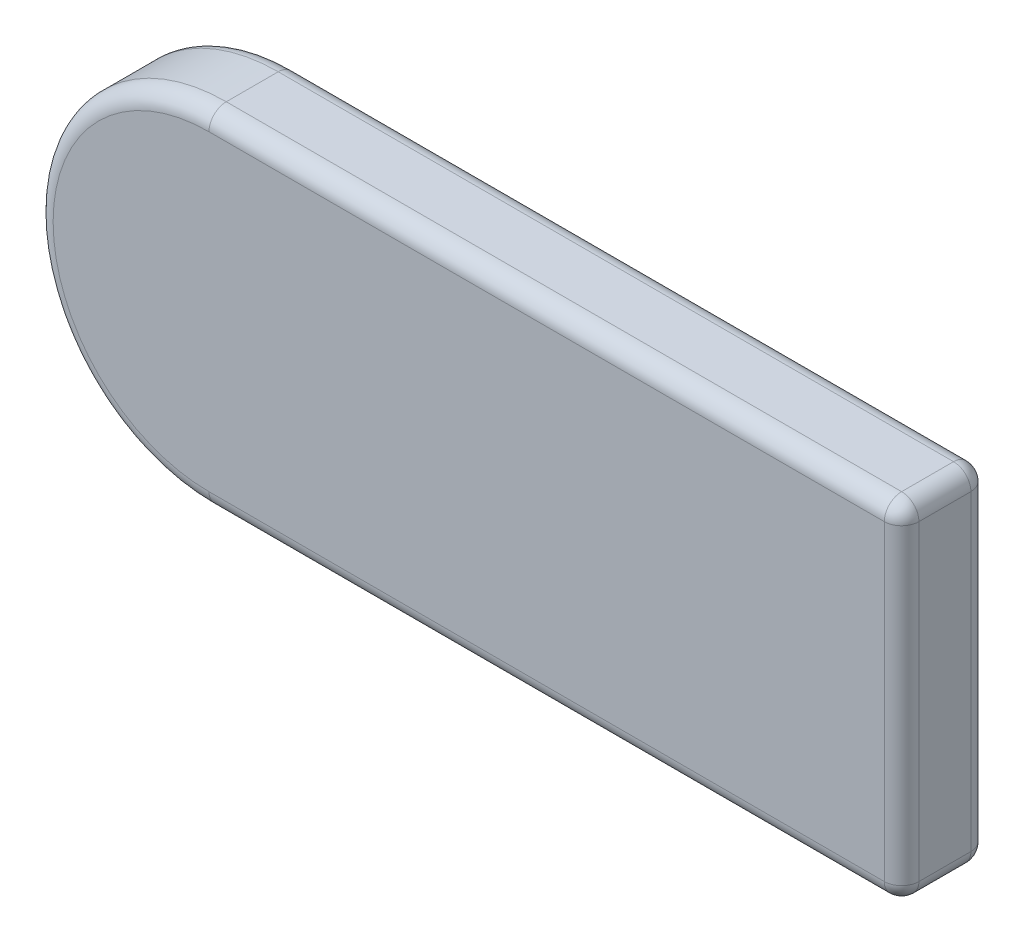
ISO-10303-21;
HEADER;
FILE_DESCRIPTION(('STEP AP214'),'2;1');
FILE_NAME('part.step','',(''),(''),'','','');
FILE_SCHEMA(('AUTOMOTIVE_DESIGN { 1 0 10303 214 1 1 1 1 }'));
ENDSEC;
DATA;
#1=APPLICATION_CONTEXT('core data for automotive mechanical design processes');
#2=APPLICATION_PROTOCOL_DEFINITION('international standard','automotive_design',2000,#1);
#3=PRODUCT_CONTEXT('',#1,'mechanical');
#4=PRODUCT('Part','Part','',(#3));
#5=PRODUCT_RELATED_PRODUCT_CATEGORY('part','',(#4));
#6=PRODUCT_DEFINITION_FORMATION('','',#4);
#7=PRODUCT_DEFINITION_CONTEXT('part definition',#1,'design');
#8=PRODUCT_DEFINITION('design','',#6,#7);
#9=PRODUCT_DEFINITION_SHAPE('','',#8);
#10=(LENGTH_UNIT() NAMED_UNIT(*) SI_UNIT(.MILLI.,.METRE.));
#11=(NAMED_UNIT(*) PLANE_ANGLE_UNIT() SI_UNIT($,.RADIAN.));
#12=(NAMED_UNIT(*) SI_UNIT($,.STERADIAN.) SOLID_ANGLE_UNIT());
#13=UNCERTAINTY_MEASURE_WITH_UNIT(LENGTH_MEASURE(1.E-05),#10,'distance_accuracy_value','');
#14=(GEOMETRIC_REPRESENTATION_CONTEXT(3) GLOBAL_UNCERTAINTY_ASSIGNED_CONTEXT((#13)) GLOBAL_UNIT_ASSIGNED_CONTEXT((#10,
#11,#12)) REPRESENTATION_CONTEXT('',''));
#15=CARTESIAN_POINT('',(0.,0.,0.));
#16=DIRECTION('',(0.,0.,1.));
#17=DIRECTION('',(1.,0.,0.));
#18=AXIS2_PLACEMENT_3D('',#15,#16,#17);
#19=CARTESIAN_POINT('',(2.,-1.,0.5));
#20=DIRECTION('',(-1.,0.,0.));
#21=DIRECTION('',(0.,0.,1.));
#22=AXIS2_PLACEMENT_3D('',#19,#20,#21);
#23=PLANE('',#22);
#24=DIRECTION('',(0.,0.,-1.));
#25=VECTOR('',#24,1.);
#26=CARTESIAN_POINT('',(2.,-0.9,0.));
#27=LINE('',#26,#25);
#28=CARTESIAN_POINT('',(2.,-0.9,0.4));
#29=VERTEX_POINT('',#28);
#30=CARTESIAN_POINT('',(2.,-0.9,0.1));
#31=VERTEX_POINT('',#30);
#32=EDGE_CURVE('E119',#29,#31,#27,.T.);
#33=ORIENTED_EDGE('',*,*,#32,.T.);
#34=DIRECTION('',(0.,1.,0.));
#35=VECTOR('',#34,1.);
#36=CARTESIAN_POINT('',(2.,-1.,0.1));
#37=LINE('',#36,#35);
#38=CARTESIAN_POINT('',(2.,0.9,0.1));
#39=VERTEX_POINT('',#38);
#40=EDGE_CURVE('E114',#31,#39,#37,.T.);
#41=ORIENTED_EDGE('',*,*,#40,.T.);
#42=DIRECTION('',(0.,0.,-1.));
#43=VECTOR('',#42,1.);
#44=CARTESIAN_POINT('',(2.,0.9,0.5));
#45=LINE('',#44,#43);
#46=CARTESIAN_POINT('',(2.,0.9,0.4));
#47=VERTEX_POINT('',#46);
#48=EDGE_CURVE('E116',#39,#47,#45,.F.);
#49=ORIENTED_EDGE('',*,*,#48,.T.);
#50=DIRECTION('',(0.,1.,0.));
#51=VECTOR('',#50,1.);
#52=CARTESIAN_POINT('',(2.,-0.9,0.4));
#53=LINE('',#52,#51);
#54=EDGE_CURVE('E125',#47,#29,#53,.F.);
#55=ORIENTED_EDGE('',*,*,#54,.T.);
#56=EDGE_LOOP('',(#33,#41,#49,#55));
#57=FACE_BOUND('',#56,.T.);
#58=ADVANCED_FACE('F36',(#57),#23,.F.);
#59=CARTESIAN_POINT('',(2.,1.,0.5));
#60=DIRECTION('',(0.,-1.,0.));
#61=DIRECTION('',(1.,0.,0.));
#62=AXIS2_PLACEMENT_3D('',#59,#60,#61);
#63=PLANE('',#62);
#64=DIRECTION('',(0.,0.,-1.));
#65=VECTOR('',#64,1.);
#66=CARTESIAN_POINT('',(1.9,1.,0.5));
#67=LINE('',#66,#65);
#68=CARTESIAN_POINT('',(1.9,1.,0.4));
#69=VERTEX_POINT('',#68);
#70=CARTESIAN_POINT('',(1.9,1.,0.1));
#71=VERTEX_POINT('',#70);
#72=EDGE_CURVE('E235',#69,#71,#67,.T.);
#73=ORIENTED_EDGE('',*,*,#72,.T.);
#74=DIRECTION('',(-1.,0.,0.));
#75=VECTOR('',#74,1.);
#76=CARTESIAN_POINT('',(2.,1.,0.1));
#77=LINE('',#76,#75);
#78=CARTESIAN_POINT('',(-2.,1.,0.1));
#79=VERTEX_POINT('',#78);
#80=EDGE_CURVE('E231',#71,#79,#77,.T.);
#81=ORIENTED_EDGE('',*,*,#80,.T.);
#82=DIRECTION('',(0.,0.,-1.));
#83=VECTOR('',#82,1.);
#84=CARTESIAN_POINT('',(-2.,1.,0.5));
#85=LINE('',#84,#83);
#86=CARTESIAN_POINT('',(-2.,1.,0.4));
#87=VERTEX_POINT('',#86);
#88=EDGE_CURVE('E136',#87,#79,#85,.T.);
#89=ORIENTED_EDGE('',*,*,#88,.F.);
#90=DIRECTION('',(-1.,0.,0.));
#91=VECTOR('',#90,1.);
#92=CARTESIAN_POINT('',(1.9,1.,0.4));
#93=LINE('',#92,#91);
#94=EDGE_CURVE('E144',#87,#69,#93,.F.);
#95=ORIENTED_EDGE('',*,*,#94,.T.);
#96=EDGE_LOOP('',(#73,#81,#89,#95));
#97=FACE_BOUND('',#96,.T.);
#98=ADVANCED_FACE('F272',(#97),#63,.F.);
#99=CARTESIAN_POINT('',(-2.,0.,0.5));
#100=DIRECTION('',(0.,0.,-1.));
#101=DIRECTION('',(-1.,0.,0.));
#102=AXIS2_PLACEMENT_3D('',#99,#100,#101);
#103=CYLINDRICAL_SURFACE('',#102,1.);
#104=ORIENTED_EDGE('',*,*,#88,.T.);
#105=CARTESIAN_POINT('',(-2.,0.,0.1));
#106=DIRECTION('',(0.,0.,1.));
#107=DIRECTION('',(1.,0.,0.));
#108=AXIS2_PLACEMENT_3D('',#105,#106,#107);
#109=CIRCLE('',#108,1.);
#110=CARTESIAN_POINT('',(-2.,-1.,0.1));
#111=VERTEX_POINT('',#110);
#112=EDGE_CURVE('E196',#79,#111,#109,.T.);
#113=ORIENTED_EDGE('',*,*,#112,.T.);
#114=DIRECTION('',(0.,0.,-1.));
#115=VECTOR('',#114,1.);
#116=CARTESIAN_POINT('',(-2.,-1.,0.5));
#117=LINE('',#116,#115);
#118=CARTESIAN_POINT('',(-2.,-1.,0.4));
#119=VERTEX_POINT('',#118);
#120=EDGE_CURVE('E167',#119,#111,#117,.T.);
#121=ORIENTED_EDGE('',*,*,#120,.F.);
#122=CARTESIAN_POINT('',(-2.,0.,0.4));
#123=DIRECTION('',(0.,0.,1.));
#124=DIRECTION('',(1.,0.,0.));
#125=AXIS2_PLACEMENT_3D('',#122,#123,#124);
#126=CIRCLE('',#125,1.);
#127=EDGE_CURVE('E199',#119,#87,#126,.F.);
#128=ORIENTED_EDGE('',*,*,#127,.T.);
#129=EDGE_LOOP('',(#104,#113,#121,#128));
#130=FACE_BOUND('',#129,.T.);
#131=ADVANCED_FACE('F276',(#130),#103,.T.);
#132=CARTESIAN_POINT('',(2.,-1.,0.5));
#133=DIRECTION('',(0.,-1.,0.));
#134=DIRECTION('',(1.,0.,0.));
#135=AXIS2_PLACEMENT_3D('',#132,#133,#134);
#136=PLANE('',#135);
#137=ORIENTED_EDGE('',*,*,#120,.T.);
#138=DIRECTION('',(-1.,0.,0.));
#139=VECTOR('',#138,1.);
#140=CARTESIAN_POINT('',(1.9,-1.,0.1));
#141=LINE('',#140,#139);
#142=CARTESIAN_POINT('',(1.9,-1.,0.1));
#143=VERTEX_POINT('',#142);
#144=EDGE_CURVE('E195',#111,#143,#141,.F.);
#145=ORIENTED_EDGE('',*,*,#144,.T.);
#146=DIRECTION('',(0.,0.,-1.));
#147=VECTOR('',#146,1.);
#148=CARTESIAN_POINT('',(1.9,-1.,0.5));
#149=LINE('',#148,#147);
#150=CARTESIAN_POINT('',(1.9,-1.,0.4));
#151=VERTEX_POINT('',#150);
#152=EDGE_CURVE('E237',#143,#151,#149,.F.);
#153=ORIENTED_EDGE('',*,*,#152,.T.);
#154=DIRECTION('',(-1.,0.,0.));
#155=VECTOR('',#154,1.);
#156=CARTESIAN_POINT('',(2.,-1.,0.4));
#157=LINE('',#156,#155);
#158=EDGE_CURVE('E190',#151,#119,#157,.T.);
#159=ORIENTED_EDGE('',*,*,#158,.T.);
#160=EDGE_LOOP('',(#137,#145,#153,#159));
#161=FACE_BOUND('',#160,.T.);
#162=ADVANCED_FACE('F242',(#161),#136,.T.);
#163=CARTESIAN_POINT('',(-2.,0.,0.5));
#164=DIRECTION('',(0.,0.,1.));
#165=DIRECTION('',(1.,0.,0.));
#166=AXIS2_PLACEMENT_3D('',#163,#164,#165);
#167=PLANE('',#166);
#168=DIRECTION('',(-1.,0.,0.));
#169=VECTOR('',#168,1.);
#170=CARTESIAN_POINT('',(-2.,0.9,0.5));
#171=LINE('',#170,#169);
#172=CARTESIAN_POINT('',(1.9,0.9,0.5));
#173=VERTEX_POINT('',#172);
#174=CARTESIAN_POINT('',(-2.,0.9,0.5));
#175=VERTEX_POINT('',#174);
#176=EDGE_CURVE('E45',#173,#175,#171,.T.);
#177=ORIENTED_EDGE('',*,*,#176,.T.);
#178=CARTESIAN_POINT('',(-2.,0.,0.5));
#179=DIRECTION('',(0.,0.,1.));
#180=DIRECTION('',(1.,0.,0.));
#181=AXIS2_PLACEMENT_3D('',#178,#179,#180);
#182=CIRCLE('',#181,0.9);
#183=CARTESIAN_POINT('',(-2.,-0.9,0.5));
#184=VERTEX_POINT('',#183);
#185=EDGE_CURVE('E11',#175,#184,#182,.T.);
#186=ORIENTED_EDGE('',*,*,#185,.T.);
#187=DIRECTION('',(-1.,0.,0.));
#188=VECTOR('',#187,1.);
#189=CARTESIAN_POINT('',(-2.,-0.9,0.5));
#190=LINE('',#189,#188);
#191=CARTESIAN_POINT('',(1.9,-0.9,0.5));
#192=VERTEX_POINT('',#191);
#193=EDGE_CURVE('E124',#184,#192,#190,.F.);
#194=ORIENTED_EDGE('',*,*,#193,.T.);
#195=DIRECTION('',(0.,1.,0.));
#196=VECTOR('',#195,1.);
#197=CARTESIAN_POINT('',(1.9,0.9,0.5));
#198=LINE('',#197,#196);
#199=EDGE_CURVE('E56',#192,#173,#198,.T.);
#200=ORIENTED_EDGE('',*,*,#199,.T.);
#201=EDGE_LOOP('',(#177,#186,#194,#200));
#202=FACE_BOUND('',#201,.T.);
#203=ADVANCED_FACE('F208',(#202),#167,.T.);
#204=CARTESIAN_POINT('',(-2.,0.,0.));
#205=DIRECTION('',(0.,0.,1.));
#206=DIRECTION('',(1.,0.,0.));
#207=AXIS2_PLACEMENT_3D('',#204,#205,#206);
#208=PLANE('',#207);
#209=CARTESIAN_POINT('',(-2.,0.,0.));
#210=DIRECTION('',(0.,0.,1.));
#211=DIRECTION('',(1.,0.,0.));
#212=AXIS2_PLACEMENT_3D('',#209,#210,#211);
#213=CIRCLE('',#212,0.9);
#214=CARTESIAN_POINT('',(-2.,-0.9,0.));
#215=VERTEX_POINT('',#214);
#216=CARTESIAN_POINT('',(-2.,0.9,0.));
#217=VERTEX_POINT('',#216);
#218=EDGE_CURVE('E224',#215,#217,#213,.F.);
#219=ORIENTED_EDGE('',*,*,#218,.T.);
#220=DIRECTION('',(-1.,0.,0.));
#221=VECTOR('',#220,1.);
#222=CARTESIAN_POINT('',(-2.,0.9,0.));
#223=LINE('',#222,#221);
#224=CARTESIAN_POINT('',(1.9,0.9,0.));
#225=VERTEX_POINT('',#224);
#226=EDGE_CURVE('E223',#217,#225,#223,.F.);
#227=ORIENTED_EDGE('',*,*,#226,.T.);
#228=DIRECTION('',(0.,1.,0.));
#229=VECTOR('',#228,1.);
#230=CARTESIAN_POINT('',(1.9,0.,0.));
#231=LINE('',#230,#229);
#232=CARTESIAN_POINT('',(1.9,-0.9,0.));
#233=VERTEX_POINT('',#232);
#234=EDGE_CURVE('E148',#225,#233,#231,.F.);
#235=ORIENTED_EDGE('',*,*,#234,.T.);
#236=DIRECTION('',(-1.,0.,0.));
#237=VECTOR('',#236,1.);
#238=CARTESIAN_POINT('',(-2.,-0.9,0.));
#239=LINE('',#238,#237);
#240=EDGE_CURVE('E228',#233,#215,#239,.T.);
#241=ORIENTED_EDGE('',*,*,#240,.T.);
#242=EDGE_LOOP('',(#219,#227,#235,#241));
#243=FACE_BOUND('',#242,.T.);
#244=ADVANCED_FACE('F257',(#243),#208,.F.);
#245=CARTESIAN_POINT('',(1.9,-0.9,0.5));
#246=DIRECTION('',(0.,0.,1.));
#247=DIRECTION('',(1.,0.,0.));
#248=AXIS2_PLACEMENT_3D('',#245,#246,#247);
#249=CYLINDRICAL_SURFACE('',#248,0.1);
#250=ORIENTED_EDGE('',*,*,#152,.F.);
#251=CARTESIAN_POINT('',(1.9,-0.9,0.1));
#252=DIRECTION('',(0.,0.,1.));
#253=DIRECTION('',(1.,0.,0.));
#254=AXIS2_PLACEMENT_3D('',#251,#252,#253);
#255=CIRCLE('',#254,0.1);
#256=EDGE_CURVE('E204',#143,#31,#255,.T.);
#257=ORIENTED_EDGE('',*,*,#256,.T.);
#258=ORIENTED_EDGE('',*,*,#32,.F.);
#259=CARTESIAN_POINT('',(1.9,-0.9,0.4));
#260=DIRECTION('',(0.,0.,1.));
#261=DIRECTION('',(1.,0.,0.));
#262=AXIS2_PLACEMENT_3D('',#259,#260,#261);
#263=CIRCLE('',#262,0.1);
#264=EDGE_CURVE('E184',#29,#151,#263,.F.);
#265=ORIENTED_EDGE('',*,*,#264,.T.);
#266=EDGE_LOOP('',(#250,#257,#258,#265));
#267=FACE_BOUND('',#266,.T.);
#268=ADVANCED_FACE('F261',(#267),#249,.T.);
#269=CARTESIAN_POINT('',(1.9,0.9,0.5));
#270=DIRECTION('',(0.,0.,-1.));
#271=DIRECTION('',(-1.,0.,0.));
#272=AXIS2_PLACEMENT_3D('',#269,#270,#271);
#273=CYLINDRICAL_SURFACE('',#272,0.1);
#274=ORIENTED_EDGE('',*,*,#48,.F.);
#275=CARTESIAN_POINT('',(1.9,0.9,0.1));
#276=DIRECTION('',(0.,0.,-1.));
#277=DIRECTION('',(-1.,0.,0.));
#278=AXIS2_PLACEMENT_3D('',#275,#276,#277);
#279=CIRCLE('',#278,0.1);
#280=EDGE_CURVE('E132',#39,#71,#279,.F.);
#281=ORIENTED_EDGE('',*,*,#280,.T.);
#282=ORIENTED_EDGE('',*,*,#72,.F.);
#283=CARTESIAN_POINT('',(1.9,0.9,0.4));
#284=DIRECTION('',(0.,0.,-1.));
#285=DIRECTION('',(-1.,0.,0.));
#286=AXIS2_PLACEMENT_3D('',#283,#284,#285);
#287=CIRCLE('',#286,0.1);
#288=EDGE_CURVE('E135',#69,#47,#287,.T.);
#289=ORIENTED_EDGE('',*,*,#288,.T.);
#290=EDGE_LOOP('',(#274,#281,#282,#289));
#291=FACE_BOUND('',#290,.T.);
#292=ADVANCED_FACE('F130',(#291),#273,.T.);
#293=CARTESIAN_POINT('',(-2.,-0.9,0.1));
#294=DIRECTION('',(1.,0.,0.));
#295=DIRECTION('',(0.,1.,0.));
#296=AXIS2_PLACEMENT_3D('',#293,#294,#295);
#297=CYLINDRICAL_SURFACE('',#296,0.1);
#298=CARTESIAN_POINT('',(1.9,-0.9,0.1));
#299=DIRECTION('',(1.,0.,0.));
#300=DIRECTION('',(0.,0.,-1.));
#301=AXIS2_PLACEMENT_3D('',#298,#299,#300);
#302=CIRCLE('',#301,0.1);
#303=EDGE_CURVE('E161',#143,#233,#302,.T.);
#304=ORIENTED_EDGE('',*,*,#303,.F.);
#305=ORIENTED_EDGE('',*,*,#144,.F.);
#306=CARTESIAN_POINT('',(-2.,-0.9,0.1));
#307=DIRECTION('',(-1.,0.,0.));
#308=DIRECTION('',(0.,0.,1.));
#309=AXIS2_PLACEMENT_3D('',#306,#307,#308);
#310=CIRCLE('',#309,0.1);
#311=EDGE_CURVE('E164',#215,#111,#310,.T.);
#312=ORIENTED_EDGE('',*,*,#311,.F.);
#313=ORIENTED_EDGE('',*,*,#240,.F.);
#314=EDGE_LOOP('',(#304,#305,#312,#313));
#315=FACE_BOUND('',#314,.T.);
#316=ADVANCED_FACE('F247',(#315),#297,.T.);
#317=CARTESIAN_POINT('',(-2.,0.,0.1));
#318=DIRECTION('',(0.,0.,1.));
#319=DIRECTION('',(1.,0.,0.));
#320=AXIS2_PLACEMENT_3D('',#317,#318,#319);
#321=TOROIDAL_SURFACE('',#320,0.9,0.1);
#322=ORIENTED_EDGE('',*,*,#311,.T.);
#323=ORIENTED_EDGE('',*,*,#112,.F.);
#324=CARTESIAN_POINT('',(-2.,0.9,0.1));
#325=DIRECTION('',(1.,0.,0.));
#326=DIRECTION('',(0.,0.,-1.));
#327=AXIS2_PLACEMENT_3D('',#324,#325,#326);
#328=CIRCLE('',#327,0.1);
#329=EDGE_CURVE('E158',#217,#79,#328,.T.);
#330=ORIENTED_EDGE('',*,*,#329,.F.);
#331=ORIENTED_EDGE('',*,*,#218,.F.);
#332=EDGE_LOOP('',(#322,#323,#330,#331));
#333=FACE_BOUND('',#332,.T.);
#334=ADVANCED_FACE('F253',(#333),#321,.T.);
#335=CARTESIAN_POINT('',(1.9,-0.9,0.1));
#336=DIRECTION('',(0.,0.,1.));
#337=DIRECTION('',(1.,0.,0.));
#338=AXIS2_PLACEMENT_3D('',#335,#336,#337);
#339=SPHERICAL_SURFACE('',#338,0.1);
#340=ORIENTED_EDGE('',*,*,#256,.F.);
#341=ORIENTED_EDGE('',*,*,#303,.T.);
#342=CARTESIAN_POINT('',(1.9,-0.9,0.1));
#343=DIRECTION('',(0.,1.,0.));
#344=DIRECTION('',(0.,0.,1.));
#345=AXIS2_PLACEMENT_3D('',#342,#343,#344);
#346=CIRCLE('',#345,0.1);
#347=EDGE_CURVE('E151',#31,#233,#346,.T.);
#348=ORIENTED_EDGE('',*,*,#347,.F.);
#349=EDGE_LOOP('',(#340,#341,#348));
#350=FACE_BOUND('',#349,.T.);
#351=ADVANCED_FACE('F259',(#350),#339,.T.);
#352=CARTESIAN_POINT('',(2.,0.9,0.1));
#353=DIRECTION('',(-1.,0.,0.));
#354=DIRECTION('',(0.,-1.,0.));
#355=AXIS2_PLACEMENT_3D('',#352,#353,#354);
#356=CYLINDRICAL_SURFACE('',#355,0.1);
#357=ORIENTED_EDGE('',*,*,#329,.T.);
#358=ORIENTED_EDGE('',*,*,#80,.F.);
#359=CARTESIAN_POINT('',(1.9,0.9,0.1));
#360=DIRECTION('',(1.,0.,0.));
#361=DIRECTION('',(0.,0.,-1.));
#362=AXIS2_PLACEMENT_3D('',#359,#360,#361);
#363=CIRCLE('',#362,0.1);
#364=EDGE_CURVE('E142',#225,#71,#363,.T.);
#365=ORIENTED_EDGE('',*,*,#364,.F.);
#366=ORIENTED_EDGE('',*,*,#226,.F.);
#367=EDGE_LOOP('',(#357,#358,#365,#366));
#368=FACE_BOUND('',#367,.T.);
#369=ADVANCED_FACE('F328',(#368),#356,.T.);
#370=CARTESIAN_POINT('',(1.9,-1.,0.1));
#371=DIRECTION('',(0.,1.,0.));
#372=DIRECTION('',(0.,0.,1.));
#373=AXIS2_PLACEMENT_3D('',#370,#371,#372);
#374=CYLINDRICAL_SURFACE('',#373,0.1);
#375=ORIENTED_EDGE('',*,*,#347,.T.);
#376=ORIENTED_EDGE('',*,*,#234,.F.);
#377=CARTESIAN_POINT('',(1.9,0.9,0.1));
#378=DIRECTION('',(0.,1.,0.));
#379=DIRECTION('',(0.,0.,1.));
#380=AXIS2_PLACEMENT_3D('',#377,#378,#379);
#381=CIRCLE('',#380,0.1);
#382=EDGE_CURVE('E140',#39,#225,#381,.T.);
#383=ORIENTED_EDGE('',*,*,#382,.F.);
#384=ORIENTED_EDGE('',*,*,#40,.F.);
#385=EDGE_LOOP('',(#375,#376,#383,#384));
#386=FACE_BOUND('',#385,.T.);
#387=ADVANCED_FACE('F147',(#386),#374,.T.);
#388=CARTESIAN_POINT('',(1.9,0.9,0.1));
#389=DIRECTION('',(0.,0.,1.));
#390=DIRECTION('',(1.,0.,0.));
#391=AXIS2_PLACEMENT_3D('',#388,#389,#390);
#392=SPHERICAL_SURFACE('',#391,0.1);
#393=ORIENTED_EDGE('',*,*,#364,.T.);
#394=ORIENTED_EDGE('',*,*,#280,.F.);
#395=ORIENTED_EDGE('',*,*,#382,.T.);
#396=EDGE_LOOP('',(#393,#394,#395));
#397=FACE_BOUND('',#396,.T.);
#398=ADVANCED_FACE('F139',(#397),#392,.T.);
#399=CARTESIAN_POINT('',(1.9,0.,0.4));
#400=DIRECTION('',(0.,-1.,0.));
#401=DIRECTION('',(0.,0.,-1.));
#402=AXIS2_PLACEMENT_3D('',#399,#400,#401);
#403=CYLINDRICAL_SURFACE('',#402,0.1);
#404=CARTESIAN_POINT('',(1.9,-0.9,0.4));
#405=DIRECTION('',(0.,-1.,0.));
#406=DIRECTION('',(0.,0.,-1.));
#407=AXIS2_PLACEMENT_3D('',#404,#405,#406);
#408=CIRCLE('',#407,0.1);
#409=EDGE_CURVE('E154',#29,#192,#408,.T.);
#410=ORIENTED_EDGE('',*,*,#409,.F.);
#411=ORIENTED_EDGE('',*,*,#54,.F.);
#412=CARTESIAN_POINT('',(1.9,0.9,0.4));
#413=DIRECTION('',(0.,1.,0.));
#414=DIRECTION('',(0.,0.,1.));
#415=AXIS2_PLACEMENT_3D('',#412,#413,#414);
#416=CIRCLE('',#415,0.1);
#417=EDGE_CURVE('E40',#173,#47,#416,.T.);
#418=ORIENTED_EDGE('',*,*,#417,.F.);
#419=ORIENTED_EDGE('',*,*,#199,.F.);
#420=EDGE_LOOP('',(#410,#411,#418,#419));
#421=FACE_BOUND('',#420,.T.);
#422=ADVANCED_FACE('F38',(#421),#403,.T.);
#423=CARTESIAN_POINT('',(1.9,0.9,0.4));
#424=DIRECTION('',(0.,0.,1.));
#425=DIRECTION('',(1.,0.,0.));
#426=AXIS2_PLACEMENT_3D('',#423,#424,#425);
#427=SPHERICAL_SURFACE('',#426,0.1);
#428=ORIENTED_EDGE('',*,*,#417,.T.);
#429=ORIENTED_EDGE('',*,*,#288,.F.);
#430=CARTESIAN_POINT('',(1.9,0.9,0.4));
#431=DIRECTION('',(-1.,0.,0.));
#432=DIRECTION('',(0.,0.,1.));
#433=AXIS2_PLACEMENT_3D('',#430,#431,#432);
#434=CIRCLE('',#433,0.1);
#435=EDGE_CURVE('E175',#173,#69,#434,.T.);
#436=ORIENTED_EDGE('',*,*,#435,.F.);
#437=EDGE_LOOP('',(#428,#429,#436));
#438=FACE_BOUND('',#437,.T.);
#439=ADVANCED_FACE('F212',(#438),#427,.T.);
#440=CARTESIAN_POINT('',(1.9,-0.9,0.4));
#441=DIRECTION('',(0.,0.,1.));
#442=DIRECTION('',(1.,0.,0.));
#443=AXIS2_PLACEMENT_3D('',#440,#441,#442);
#444=SPHERICAL_SURFACE('',#443,0.1);
#445=ORIENTED_EDGE('',*,*,#264,.F.);
#446=ORIENTED_EDGE('',*,*,#409,.T.);
#447=CARTESIAN_POINT('',(1.9,-0.9,0.4));
#448=DIRECTION('',(-1.,0.,0.));
#449=DIRECTION('',(0.,0.,1.));
#450=AXIS2_PLACEMENT_3D('',#447,#448,#449);
#451=CIRCLE('',#450,0.1);
#452=EDGE_CURVE('E172',#151,#192,#451,.T.);
#453=ORIENTED_EDGE('',*,*,#452,.F.);
#454=EDGE_LOOP('',(#445,#446,#453));
#455=FACE_BOUND('',#454,.T.);
#456=ADVANCED_FACE('F182',(#455),#444,.T.);
#457=CARTESIAN_POINT('',(-2.,0.9,0.4));
#458=DIRECTION('',(1.,0.,0.));
#459=DIRECTION('',(0.,1.,0.));
#460=AXIS2_PLACEMENT_3D('',#457,#458,#459);
#461=CYLINDRICAL_SURFACE('',#460,0.1);
#462=ORIENTED_EDGE('',*,*,#435,.T.);
#463=ORIENTED_EDGE('',*,*,#94,.F.);
#464=CARTESIAN_POINT('',(-2.,0.9,0.4));
#465=DIRECTION('',(-1.,0.,0.));
#466=DIRECTION('',(0.,0.,1.));
#467=AXIS2_PLACEMENT_3D('',#464,#465,#466);
#468=CIRCLE('',#467,0.1);
#469=EDGE_CURVE('E170',#175,#87,#468,.T.);
#470=ORIENTED_EDGE('',*,*,#469,.F.);
#471=ORIENTED_EDGE('',*,*,#176,.F.);
#472=EDGE_LOOP('',(#462,#463,#470,#471));
#473=FACE_BOUND('',#472,.T.);
#474=ADVANCED_FACE('F215',(#473),#461,.T.);
#475=CARTESIAN_POINT('',(2.,-0.9,0.4));
#476=DIRECTION('',(-1.,0.,0.));
#477=DIRECTION('',(0.,-1.,0.));
#478=AXIS2_PLACEMENT_3D('',#475,#476,#477);
#479=CYLINDRICAL_SURFACE('',#478,0.1);
#480=ORIENTED_EDGE('',*,*,#452,.T.);
#481=ORIENTED_EDGE('',*,*,#193,.F.);
#482=CARTESIAN_POINT('',(-2.,-0.9,0.4));
#483=DIRECTION('',(-1.,0.,0.));
#484=DIRECTION('',(0.,0.,1.));
#485=AXIS2_PLACEMENT_3D('',#482,#483,#484);
#486=CIRCLE('',#485,0.1);
#487=EDGE_CURVE('E168',#119,#184,#486,.T.);
#488=ORIENTED_EDGE('',*,*,#487,.F.);
#489=ORIENTED_EDGE('',*,*,#158,.F.);
#490=EDGE_LOOP('',(#480,#481,#488,#489));
#491=FACE_BOUND('',#490,.T.);
#492=ADVANCED_FACE('F188',(#491),#479,.T.);
#493=CARTESIAN_POINT('',(-2.,0.,0.4));
#494=DIRECTION('',(0.,0.,1.));
#495=DIRECTION('',(1.,0.,0.));
#496=AXIS2_PLACEMENT_3D('',#493,#494,#495);
#497=TOROIDAL_SURFACE('',#496,0.9,0.1);
#498=ORIENTED_EDGE('',*,*,#469,.T.);
#499=ORIENTED_EDGE('',*,*,#127,.F.);
#500=ORIENTED_EDGE('',*,*,#487,.T.);
#501=ORIENTED_EDGE('',*,*,#185,.F.);
#502=EDGE_LOOP('',(#498,#499,#500,#501));
#503=FACE_BOUND('',#502,.T.);
#504=ADVANCED_FACE('F219',(#503),#497,.T.);
#505=CLOSED_SHELL('',(#58,#98,#131,#162,#203,#244,#268,#292,#316,#334,#351,#369,#387,#398,#422,
#439,#456,#474,#492,#504));
#506=MANIFOLD_SOLID_BREP('B2',#505);
#507=ADVANCED_BREP_SHAPE_REPRESENTATION('',(#18,#506),#14);
#508=SHAPE_DEFINITION_REPRESENTATION(#9,#507);
ENDSEC;
END-ISO-10303-21;
